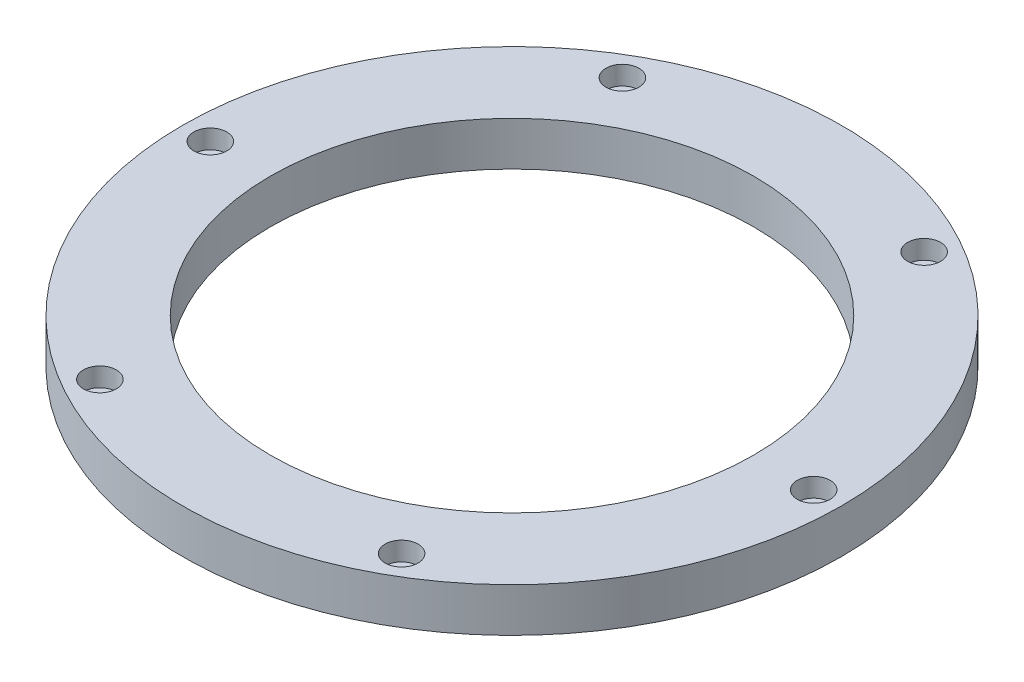
ISO-10303-21;
HEADER;
FILE_DESCRIPTION(('STEP AP214'),'2;1');
FILE_NAME('part.step','',(''),(''),'','','');
FILE_SCHEMA(('AUTOMOTIVE_DESIGN { 1 0 10303 214 1 1 1 1 }'));
ENDSEC;
DATA;
#1=APPLICATION_CONTEXT('core data for automotive mechanical design processes');
#2=APPLICATION_PROTOCOL_DEFINITION('international standard','automotive_design',2000,#1);
#3=PRODUCT_CONTEXT('',#1,'mechanical');
#4=PRODUCT('Part','Part','',(#3));
#5=PRODUCT_RELATED_PRODUCT_CATEGORY('part','',(#4));
#6=PRODUCT_DEFINITION_FORMATION('','',#4);
#7=PRODUCT_DEFINITION_CONTEXT('part definition',#1,'design');
#8=PRODUCT_DEFINITION('design','',#6,#7);
#9=PRODUCT_DEFINITION_SHAPE('','',#8);
#10=(LENGTH_UNIT() NAMED_UNIT(*) SI_UNIT(.MILLI.,.METRE.));
#11=(NAMED_UNIT(*) PLANE_ANGLE_UNIT() SI_UNIT($,.RADIAN.));
#12=(NAMED_UNIT(*) SI_UNIT($,.STERADIAN.) SOLID_ANGLE_UNIT());
#13=UNCERTAINTY_MEASURE_WITH_UNIT(LENGTH_MEASURE(1.E-05),#10,'distance_accuracy_value','');
#14=(GEOMETRIC_REPRESENTATION_CONTEXT(3) GLOBAL_UNCERTAINTY_ASSIGNED_CONTEXT((#13)) GLOBAL_UNIT_ASSIGNED_CONTEXT((#10,
#11,#12)) REPRESENTATION_CONTEXT('',''));
#15=CARTESIAN_POINT('',(0.,0.,0.));
#16=DIRECTION('',(0.,0.,1.));
#17=DIRECTION('',(1.,0.,0.));
#18=AXIS2_PLACEMENT_3D('',#15,#16,#17);
#19=CARTESIAN_POINT('',(-150.,8.53105147864184,0.));
#20=DIRECTION('',(0.,1.,0.));
#21=DIRECTION('',(-1.,0.,0.));
#22=AXIS2_PLACEMENT_3D('',#19,#20,#21);
#23=PLANE('',#22);
#24=CARTESIAN_POINT('',(-137.316515214628,8.53105147864184,9.58876100773685E-13));
#25=DIRECTION('',(0.,1.,0.));
#26=DIRECTION('',(0.,0.,1.));
#27=AXIS2_PLACEMENT_3D('',#24,#25,#26);
#28=CIRCLE('',#27,7.50000000000001);
#29=CARTESIAN_POINT('',(-137.316515214628,8.53105147864184,7.50000000000097));
#30=VERTEX_POINT('',#29);
#31=EDGE_CURVE('E120',#30,#30,#28,.T.);
#32=ORIENTED_EDGE('',*,*,#31,.F.);
#33=EDGE_LOOP('',(#32));
#34=FACE_BOUND('',#33,.T.);
#35=CARTESIAN_POINT('',(-68.6582576073145,8.53105147864184,-118.91959053502));
#36=DIRECTION('',(0.,1.,0.));
#37=DIRECTION('',(0.,0.,1.));
#38=AXIS2_PLACEMENT_3D('',#35,#36,#37);
#39=CIRCLE('',#38,7.49999999999999);
#40=CARTESIAN_POINT('',(-68.6582576073145,8.53105147864184,-111.41959053502));
#41=VERTEX_POINT('',#40);
#42=EDGE_CURVE('E108',#41,#41,#39,.T.);
#43=ORIENTED_EDGE('',*,*,#42,.F.);
#44=EDGE_LOOP('',(#43));
#45=FACE_BOUND('',#44,.T.);
#46=CARTESIAN_POINT('',(68.6582576073137,8.53105147864184,-118.91959053502));
#47=DIRECTION('',(0.,1.,0.));
#48=DIRECTION('',(0.,0.,1.));
#49=AXIS2_PLACEMENT_3D('',#46,#47,#48);
#50=CIRCLE('',#49,7.49999999999999);
#51=CARTESIAN_POINT('',(68.6582576073137,8.53105147864184,-111.41959053502));
#52=VERTEX_POINT('',#51);
#53=EDGE_CURVE('E96',#52,#52,#50,.T.);
#54=ORIENTED_EDGE('',*,*,#53,.F.);
#55=EDGE_LOOP('',(#54));
#56=FACE_BOUND('',#55,.T.);
#57=CARTESIAN_POINT('',(137.316515214628,8.53105147864184,0.));
#58=DIRECTION('',(0.,1.,0.));
#59=DIRECTION('',(0.,0.,1.));
#60=AXIS2_PLACEMENT_3D('',#57,#58,#59);
#61=CIRCLE('',#60,7.50000000000001);
#62=CARTESIAN_POINT('',(137.316515214628,8.53105147864184,7.50000000000001));
#63=VERTEX_POINT('',#62);
#64=EDGE_CURVE('E84',#63,#63,#61,.T.);
#65=ORIENTED_EDGE('',*,*,#64,.F.);
#66=EDGE_LOOP('',(#65));
#67=FACE_BOUND('',#66,.T.);
#68=CARTESIAN_POINT('',(-68.6582576073128,8.53105147864184,118.919590535021));
#69=DIRECTION('',(0.,1.,0.));
#70=DIRECTION('',(0.,0.,1.));
#71=AXIS2_PLACEMENT_3D('',#68,#69,#70);
#72=CIRCLE('',#71,7.49999999999999);
#73=CARTESIAN_POINT('',(-68.6582576073128,8.53105147864184,126.419590535021));
#74=VERTEX_POINT('',#73);
#75=EDGE_CURVE('E72',#74,#74,#72,.T.);
#76=ORIENTED_EDGE('',*,*,#75,.F.);
#77=EDGE_LOOP('',(#76));
#78=FACE_BOUND('',#77,.T.);
#79=CARTESIAN_POINT('',(68.6582576073153,8.53105147864184,118.919590535019));
#80=DIRECTION('',(0.,1.,0.));
#81=DIRECTION('',(0.,0.,1.));
#82=AXIS2_PLACEMENT_3D('',#79,#80,#81);
#83=CIRCLE('',#82,7.49999999999999);
#84=CARTESIAN_POINT('',(68.6582576073153,8.53105147864184,126.419590535019));
#85=VERTEX_POINT('',#84);
#86=EDGE_CURVE('E60',#85,#85,#83,.T.);
#87=ORIENTED_EDGE('',*,*,#86,.F.);
#88=EDGE_LOOP('',(#87));
#89=FACE_BOUND('',#88,.T.);
#90=CARTESIAN_POINT('',(0.,8.53105147864184,0.));
#91=DIRECTION('',(0.,1.,0.));
#92=DIRECTION('',(-1.,0.,0.));
#93=AXIS2_PLACEMENT_3D('',#90,#91,#92);
#94=CIRCLE('',#93,150.);
#95=CARTESIAN_POINT('',(-150.,8.53105147864184,0.));
#96=VERTEX_POINT('',#95);
#97=EDGE_CURVE('E46',#96,#96,#94,.T.);
#98=ORIENTED_EDGE('',*,*,#97,.T.);
#99=EDGE_LOOP('',(#98));
#100=FACE_BOUND('',#99,.T.);
#101=CARTESIAN_POINT('',(0.,8.53105147864184,0.));
#102=DIRECTION('',(0.,1.,0.));
#103=DIRECTION('',(-1.,0.,0.));
#104=AXIS2_PLACEMENT_3D('',#101,#102,#103);
#105=CIRCLE('',#104,110.);
#106=CARTESIAN_POINT('',(-110.,8.53105147864184,0.));
#107=VERTEX_POINT('',#106);
#108=EDGE_CURVE('E10',#107,#107,#105,.T.);
#109=ORIENTED_EDGE('',*,*,#108,.F.);
#110=EDGE_LOOP('',(#109));
#111=FACE_BOUND('',#110,.T.);
#112=ADVANCED_FACE('F32',(#34,#45,#56,#67,#78,#89,#100,#111),#23,.T.);
#113=CARTESIAN_POINT('',(0.,8.53105147864184,0.));
#114=DIRECTION('',(0.,1.,0.));
#115=DIRECTION('',(-1.,0.,0.));
#116=AXIS2_PLACEMENT_3D('',#113,#114,#115);
#117=CYLINDRICAL_SURFACE('',#116,110.);
#118=ORIENTED_EDGE('',*,*,#108,.T.);
#119=EDGE_LOOP('',(#118));
#120=FACE_BOUND('',#119,.T.);
#121=CARTESIAN_POINT('',(0.,-11.4689485213582,0.));
#122=DIRECTION('',(0.,1.,0.));
#123=DIRECTION('',(-1.,0.,0.));
#124=AXIS2_PLACEMENT_3D('',#121,#122,#123);
#125=CIRCLE('',#124,110.);
#126=CARTESIAN_POINT('',(-110.,-11.4689485213582,0.));
#127=VERTEX_POINT('',#126);
#128=EDGE_CURVE('E38',#127,#127,#125,.T.);
#129=ORIENTED_EDGE('',*,*,#128,.F.);
#130=EDGE_LOOP('',(#129));
#131=FACE_BOUND('',#130,.T.);
#132=ADVANCED_FACE('F128',(#120,#131),#117,.F.);
#133=CARTESIAN_POINT('',(-150.,-11.4689485213582,0.));
#134=DIRECTION('',(0.,-1.,0.));
#135=DIRECTION('',(1.,0.,0.));
#136=AXIS2_PLACEMENT_3D('',#133,#134,#135);
#137=PLANE('',#136);
#138=CARTESIAN_POINT('',(-137.316515214628,-11.4689485213582,9.58876100773685E-13));
#139=DIRECTION('',(0.,1.,0.));
#140=DIRECTION('',(0.,0.,1.));
#141=AXIS2_PLACEMENT_3D('',#138,#139,#140);
#142=CIRCLE('',#141,4.5);
#143=CARTESIAN_POINT('',(-137.316515214628,-11.4689485213582,4.50000000000096));
#144=VERTEX_POINT('',#143);
#145=EDGE_CURVE('E111',#144,#144,#142,.T.);
#146=ORIENTED_EDGE('',*,*,#145,.T.);
#147=EDGE_LOOP('',(#146));
#148=FACE_BOUND('',#147,.T.);
#149=CARTESIAN_POINT('',(-68.6582576073145,-11.4689485213582,-118.91959053502));
#150=DIRECTION('',(0.,1.,0.));
#151=DIRECTION('',(0.,0.,1.));
#152=AXIS2_PLACEMENT_3D('',#149,#150,#151);
#153=CIRCLE('',#152,4.5);
#154=CARTESIAN_POINT('',(-68.6582576073145,-11.4689485213582,-114.41959053502));
#155=VERTEX_POINT('',#154);
#156=EDGE_CURVE('E99',#155,#155,#153,.T.);
#157=ORIENTED_EDGE('',*,*,#156,.T.);
#158=EDGE_LOOP('',(#157));
#159=FACE_BOUND('',#158,.T.);
#160=CARTESIAN_POINT('',(68.6582576073137,-11.4689485213582,-118.91959053502));
#161=DIRECTION('',(0.,1.,0.));
#162=DIRECTION('',(0.,0.,1.));
#163=AXIS2_PLACEMENT_3D('',#160,#161,#162);
#164=CIRCLE('',#163,4.5);
#165=CARTESIAN_POINT('',(68.6582576073137,-11.4689485213582,-114.41959053502));
#166=VERTEX_POINT('',#165);
#167=EDGE_CURVE('E87',#166,#166,#164,.T.);
#168=ORIENTED_EDGE('',*,*,#167,.T.);
#169=EDGE_LOOP('',(#168));
#170=FACE_BOUND('',#169,.T.);
#171=CARTESIAN_POINT('',(137.316515214628,-11.4689485213582,0.));
#172=DIRECTION('',(0.,1.,0.));
#173=DIRECTION('',(0.,0.,1.));
#174=AXIS2_PLACEMENT_3D('',#171,#172,#173);
#175=CIRCLE('',#174,4.5);
#176=CARTESIAN_POINT('',(137.316515214628,-11.4689485213582,4.5));
#177=VERTEX_POINT('',#176);
#178=EDGE_CURVE('E75',#177,#177,#175,.T.);
#179=ORIENTED_EDGE('',*,*,#178,.T.);
#180=EDGE_LOOP('',(#179));
#181=FACE_BOUND('',#180,.T.);
#182=CARTESIAN_POINT('',(-68.6582576073128,-11.4689485213582,118.919590535021));
#183=DIRECTION('',(0.,1.,0.));
#184=DIRECTION('',(0.,0.,1.));
#185=AXIS2_PLACEMENT_3D('',#182,#183,#184);
#186=CIRCLE('',#185,4.5);
#187=CARTESIAN_POINT('',(-68.6582576073128,-11.4689485213582,123.419590535021));
#188=VERTEX_POINT('',#187);
#189=EDGE_CURVE('E63',#188,#188,#186,.T.);
#190=ORIENTED_EDGE('',*,*,#189,.T.);
#191=EDGE_LOOP('',(#190));
#192=FACE_BOUND('',#191,.T.);
#193=CARTESIAN_POINT('',(68.6582576073153,-11.4689485213582,118.919590535019));
#194=DIRECTION('',(0.,1.,0.));
#195=DIRECTION('',(0.,0.,1.));
#196=AXIS2_PLACEMENT_3D('',#193,#194,#195);
#197=CIRCLE('',#196,4.5);
#198=CARTESIAN_POINT('',(68.6582576073153,-11.4689485213582,123.419590535019));
#199=VERTEX_POINT('',#198);
#200=EDGE_CURVE('E51',#199,#199,#197,.T.);
#201=ORIENTED_EDGE('',*,*,#200,.T.);
#202=EDGE_LOOP('',(#201));
#203=FACE_BOUND('',#202,.T.);
#204=ORIENTED_EDGE('',*,*,#128,.T.);
#205=EDGE_LOOP('',(#204));
#206=FACE_BOUND('',#205,.T.);
#207=CARTESIAN_POINT('',(0.,-11.4689485213582,0.));
#208=DIRECTION('',(0.,1.,0.));
#209=DIRECTION('',(-1.,0.,0.));
#210=AXIS2_PLACEMENT_3D('',#207,#208,#209);
#211=CIRCLE('',#210,150.);
#212=CARTESIAN_POINT('',(-150.,-11.4689485213582,0.));
#213=VERTEX_POINT('',#212);
#214=EDGE_CURVE('E42',#213,#213,#211,.T.);
#215=ORIENTED_EDGE('',*,*,#214,.F.);
#216=EDGE_LOOP('',(#215));
#217=FACE_BOUND('',#216,.T.);
#218=ADVANCED_FACE('F145',(#148,#159,#170,#181,#192,#203,#206,#217),#137,.T.);
#219=CARTESIAN_POINT('',(0.,8.53105147864184,0.));
#220=DIRECTION('',(0.,1.,0.));
#221=DIRECTION('',(-1.,0.,0.));
#222=AXIS2_PLACEMENT_3D('',#219,#220,#221);
#223=CYLINDRICAL_SURFACE('',#222,150.);
#224=ORIENTED_EDGE('',*,*,#214,.T.);
#225=EDGE_LOOP('',(#224));
#226=FACE_BOUND('',#225,.T.);
#227=ORIENTED_EDGE('',*,*,#97,.F.);
#228=EDGE_LOOP('',(#227));
#229=FACE_BOUND('',#228,.T.);
#230=ADVANCED_FACE('F142',(#226,#229),#223,.T.);
#231=CARTESIAN_POINT('',(68.6582576073153,8.53105147864184,118.919590535019));
#232=DIRECTION('',(0.,1.,0.));
#233=DIRECTION('',(0.,0.,1.));
#234=AXIS2_PLACEMENT_3D('',#231,#232,#233);
#235=CYLINDRICAL_SURFACE('',#234,4.5);
#236=ORIENTED_EDGE('',*,*,#200,.F.);
#237=EDGE_LOOP('',(#236));
#238=FACE_BOUND('',#237,.T.);
#239=CARTESIAN_POINT('',(68.6582576073153,-0.0689485213581625,118.919590535019));
#240=DIRECTION('',(0.,1.,0.));
#241=DIRECTION('',(0.,0.,1.));
#242=AXIS2_PLACEMENT_3D('',#239,#240,#241);
#243=CIRCLE('',#242,4.5);
#244=CARTESIAN_POINT('',(68.6582576073153,-0.0689485213581625,123.419590535019));
#245=VERTEX_POINT('',#244);
#246=EDGE_CURVE('E54',#245,#245,#243,.T.);
#247=ORIENTED_EDGE('',*,*,#246,.T.);
#248=EDGE_LOOP('',(#247));
#249=FACE_BOUND('',#248,.T.);
#250=ADVANCED_FACE('F144',(#238,#249),#235,.F.);
#251=CARTESIAN_POINT('',(73.1582576073153,-0.0689485213581625,118.919590535019));
#252=DIRECTION('',(0.,-1.,0.));
#253=DIRECTION('',(0.,0.,-1.));
#254=AXIS2_PLACEMENT_3D('',#251,#252,#253);
#255=PLANE('',#254);
#256=ORIENTED_EDGE('',*,*,#246,.F.);
#257=EDGE_LOOP('',(#256));
#258=FACE_BOUND('',#257,.T.);
#259=CARTESIAN_POINT('',(68.6582576073153,-0.0689485213581625,118.919590535019));
#260=DIRECTION('',(0.,1.,0.));
#261=DIRECTION('',(0.,0.,1.));
#262=AXIS2_PLACEMENT_3D('',#259,#260,#261);
#263=CIRCLE('',#262,7.49999999999999);
#264=CARTESIAN_POINT('',(68.6582576073153,-0.0689485213581625,126.419590535019));
#265=VERTEX_POINT('',#264);
#266=EDGE_CURVE('E57',#265,#265,#263,.T.);
#267=ORIENTED_EDGE('',*,*,#266,.T.);
#268=EDGE_LOOP('',(#267));
#269=FACE_BOUND('',#268,.T.);
#270=ADVANCED_FACE('F152',(#258,#269),#255,.F.);
#271=CARTESIAN_POINT('',(68.6582576073153,8.53105147864184,118.919590535019));
#272=DIRECTION('',(0.,1.,0.));
#273=DIRECTION('',(0.,0.,1.));
#274=AXIS2_PLACEMENT_3D('',#271,#272,#273);
#275=CYLINDRICAL_SURFACE('',#274,7.49999999999999);
#276=ORIENTED_EDGE('',*,*,#266,.F.);
#277=EDGE_LOOP('',(#276));
#278=FACE_BOUND('',#277,.T.);
#279=ORIENTED_EDGE('',*,*,#86,.T.);
#280=EDGE_LOOP('',(#279));
#281=FACE_BOUND('',#280,.T.);
#282=ADVANCED_FACE('F186',(#278,#281),#275,.F.);
#283=CARTESIAN_POINT('',(-68.6582576073128,8.53105147864184,118.919590535021));
#284=DIRECTION('',(0.,1.,0.));
#285=DIRECTION('',(0.,0.,1.));
#286=AXIS2_PLACEMENT_3D('',#283,#284,#285);
#287=CYLINDRICAL_SURFACE('',#286,4.5);
#288=ORIENTED_EDGE('',*,*,#189,.F.);
#289=EDGE_LOOP('',(#288));
#290=FACE_BOUND('',#289,.T.);
#291=CARTESIAN_POINT('',(-68.6582576073128,-0.068948521358159,118.919590535021));
#292=DIRECTION('',(0.,1.,0.));
#293=DIRECTION('',(0.,0.,1.));
#294=AXIS2_PLACEMENT_3D('',#291,#292,#293);
#295=CIRCLE('',#294,4.5);
#296=CARTESIAN_POINT('',(-68.6582576073128,-0.068948521358159,123.419590535021));
#297=VERTEX_POINT('',#296);
#298=EDGE_CURVE('E66',#297,#297,#295,.T.);
#299=ORIENTED_EDGE('',*,*,#298,.T.);
#300=EDGE_LOOP('',(#299));
#301=FACE_BOUND('',#300,.T.);
#302=ADVANCED_FACE('F195',(#290,#301),#287,.F.);
#303=CARTESIAN_POINT('',(-64.1582576073128,-0.068948521358159,118.919590535021));
#304=DIRECTION('',(0.,-1.,0.));
#305=DIRECTION('',(0.,0.,-1.));
#306=AXIS2_PLACEMENT_3D('',#303,#304,#305);
#307=PLANE('',#306);
#308=ORIENTED_EDGE('',*,*,#298,.F.);
#309=EDGE_LOOP('',(#308));
#310=FACE_BOUND('',#309,.T.);
#311=CARTESIAN_POINT('',(-68.6582576073128,-0.068948521358159,118.919590535021));
#312=DIRECTION('',(0.,1.,0.));
#313=DIRECTION('',(0.,0.,1.));
#314=AXIS2_PLACEMENT_3D('',#311,#312,#313);
#315=CIRCLE('',#314,7.49999999999999);
#316=CARTESIAN_POINT('',(-68.6582576073128,-0.068948521358159,126.419590535021));
#317=VERTEX_POINT('',#316);
#318=EDGE_CURVE('E69',#317,#317,#315,.T.);
#319=ORIENTED_EDGE('',*,*,#318,.T.);
#320=EDGE_LOOP('',(#319));
#321=FACE_BOUND('',#320,.T.);
#322=ADVANCED_FACE('F205',(#310,#321),#307,.F.);
#323=CARTESIAN_POINT('',(-68.6582576073128,8.53105147864184,118.919590535021));
#324=DIRECTION('',(0.,1.,0.));
#325=DIRECTION('',(0.,0.,1.));
#326=AXIS2_PLACEMENT_3D('',#323,#324,#325);
#327=CYLINDRICAL_SURFACE('',#326,7.49999999999999);
#328=ORIENTED_EDGE('',*,*,#318,.F.);
#329=EDGE_LOOP('',(#328));
#330=FACE_BOUND('',#329,.T.);
#331=ORIENTED_EDGE('',*,*,#75,.T.);
#332=EDGE_LOOP('',(#331));
#333=FACE_BOUND('',#332,.T.);
#334=ADVANCED_FACE('F215',(#330,#333),#327,.F.);
#335=CARTESIAN_POINT('',(137.316515214628,8.53105147864184,0.));
#336=DIRECTION('',(0.,1.,0.));
#337=DIRECTION('',(0.,0.,1.));
#338=AXIS2_PLACEMENT_3D('',#335,#336,#337);
#339=CYLINDRICAL_SURFACE('',#338,4.5);
#340=ORIENTED_EDGE('',*,*,#178,.F.);
#341=EDGE_LOOP('',(#340));
#342=FACE_BOUND('',#341,.T.);
#343=CARTESIAN_POINT('',(137.316515214628,-0.0689485213581642,0.));
#344=DIRECTION('',(0.,1.,0.));
#345=DIRECTION('',(0.,0.,1.));
#346=AXIS2_PLACEMENT_3D('',#343,#344,#345);
#347=CIRCLE('',#346,4.5);
#348=CARTESIAN_POINT('',(137.316515214628,-0.0689485213581642,4.5));
#349=VERTEX_POINT('',#348);
#350=EDGE_CURVE('E78',#349,#349,#347,.T.);
#351=ORIENTED_EDGE('',*,*,#350,.T.);
#352=EDGE_LOOP('',(#351));
#353=FACE_BOUND('',#352,.T.);
#354=ADVANCED_FACE('F225',(#342,#353),#339,.F.);
#355=CARTESIAN_POINT('',(141.816515214628,-0.0689485213581642,0.));
#356=DIRECTION('',(0.,-1.,0.));
#357=DIRECTION('',(0.,0.,-1.));
#358=AXIS2_PLACEMENT_3D('',#355,#356,#357);
#359=PLANE('',#358);
#360=ORIENTED_EDGE('',*,*,#350,.F.);
#361=EDGE_LOOP('',(#360));
#362=FACE_BOUND('',#361,.T.);
#363=CARTESIAN_POINT('',(137.316515214628,-0.0689485213581642,0.));
#364=DIRECTION('',(0.,1.,0.));
#365=DIRECTION('',(0.,0.,1.));
#366=AXIS2_PLACEMENT_3D('',#363,#364,#365);
#367=CIRCLE('',#366,7.50000000000001);
#368=CARTESIAN_POINT('',(137.316515214628,-0.0689485213581642,7.50000000000001));
#369=VERTEX_POINT('',#368);
#370=EDGE_CURVE('E81',#369,#369,#367,.T.);
#371=ORIENTED_EDGE('',*,*,#370,.T.);
#372=EDGE_LOOP('',(#371));
#373=FACE_BOUND('',#372,.T.);
#374=ADVANCED_FACE('F235',(#362,#373),#359,.F.);
#375=CARTESIAN_POINT('',(137.316515214628,8.53105147864184,0.));
#376=DIRECTION('',(0.,1.,0.));
#377=DIRECTION('',(0.,0.,1.));
#378=AXIS2_PLACEMENT_3D('',#375,#376,#377);
#379=CYLINDRICAL_SURFACE('',#378,7.50000000000001);
#380=ORIENTED_EDGE('',*,*,#370,.F.);
#381=EDGE_LOOP('',(#380));
#382=FACE_BOUND('',#381,.T.);
#383=ORIENTED_EDGE('',*,*,#64,.T.);
#384=EDGE_LOOP('',(#383));
#385=FACE_BOUND('',#384,.T.);
#386=ADVANCED_FACE('F245',(#382,#385),#379,.F.);
#387=CARTESIAN_POINT('',(68.6582576073137,8.53105147864184,-118.91959053502));
#388=DIRECTION('',(0.,1.,0.));
#389=DIRECTION('',(0.,0.,1.));
#390=AXIS2_PLACEMENT_3D('',#387,#388,#389);
#391=CYLINDRICAL_SURFACE('',#390,4.5);
#392=ORIENTED_EDGE('',*,*,#167,.F.);
#393=EDGE_LOOP('',(#392));
#394=FACE_BOUND('',#393,.T.);
#395=CARTESIAN_POINT('',(68.6582576073137,-0.0689485213581625,-118.91959053502));
#396=DIRECTION('',(0.,1.,0.));
#397=DIRECTION('',(0.,0.,1.));
#398=AXIS2_PLACEMENT_3D('',#395,#396,#397);
#399=CIRCLE('',#398,4.5);
#400=CARTESIAN_POINT('',(68.6582576073137,-0.0689485213581625,-114.41959053502));
#401=VERTEX_POINT('',#400);
#402=EDGE_CURVE('E90',#401,#401,#399,.T.);
#403=ORIENTED_EDGE('',*,*,#402,.T.);
#404=EDGE_LOOP('',(#403));
#405=FACE_BOUND('',#404,.T.);
#406=ADVANCED_FACE('F255',(#394,#405),#391,.F.);
#407=CARTESIAN_POINT('',(73.1582576073137,-0.0689485213581625,-118.91959053502));
#408=DIRECTION('',(0.,-1.,0.));
#409=DIRECTION('',(0.,0.,-1.));
#410=AXIS2_PLACEMENT_3D('',#407,#408,#409);
#411=PLANE('',#410);
#412=ORIENTED_EDGE('',*,*,#402,.F.);
#413=EDGE_LOOP('',(#412));
#414=FACE_BOUND('',#413,.T.);
#415=CARTESIAN_POINT('',(68.6582576073137,-0.0689485213581625,-118.91959053502));
#416=DIRECTION('',(0.,1.,0.));
#417=DIRECTION('',(0.,0.,1.));
#418=AXIS2_PLACEMENT_3D('',#415,#416,#417);
#419=CIRCLE('',#418,7.49999999999999);
#420=CARTESIAN_POINT('',(68.6582576073137,-0.0689485213581625,-111.41959053502));
#421=VERTEX_POINT('',#420);
#422=EDGE_CURVE('E93',#421,#421,#419,.T.);
#423=ORIENTED_EDGE('',*,*,#422,.T.);
#424=EDGE_LOOP('',(#423));
#425=FACE_BOUND('',#424,.T.);
#426=ADVANCED_FACE('F265',(#414,#425),#411,.F.);
#427=CARTESIAN_POINT('',(68.6582576073137,8.53105147864184,-118.91959053502));
#428=DIRECTION('',(0.,1.,0.));
#429=DIRECTION('',(0.,0.,1.));
#430=AXIS2_PLACEMENT_3D('',#427,#428,#429);
#431=CYLINDRICAL_SURFACE('',#430,7.49999999999999);
#432=ORIENTED_EDGE('',*,*,#422,.F.);
#433=EDGE_LOOP('',(#432));
#434=FACE_BOUND('',#433,.T.);
#435=ORIENTED_EDGE('',*,*,#53,.T.);
#436=EDGE_LOOP('',(#435));
#437=FACE_BOUND('',#436,.T.);
#438=ADVANCED_FACE('F275',(#434,#437),#431,.F.);
#439=CARTESIAN_POINT('',(-68.6582576073145,8.53105147864184,-118.91959053502));
#440=DIRECTION('',(0.,1.,0.));
#441=DIRECTION('',(0.,0.,1.));
#442=AXIS2_PLACEMENT_3D('',#439,#440,#441);
#443=CYLINDRICAL_SURFACE('',#442,4.5);
#444=ORIENTED_EDGE('',*,*,#156,.F.);
#445=EDGE_LOOP('',(#444));
#446=FACE_BOUND('',#445,.T.);
#447=CARTESIAN_POINT('',(-68.6582576073145,-0.068948521358159,-118.91959053502));
#448=DIRECTION('',(0.,1.,0.));
#449=DIRECTION('',(0.,0.,1.));
#450=AXIS2_PLACEMENT_3D('',#447,#448,#449);
#451=CIRCLE('',#450,4.5);
#452=CARTESIAN_POINT('',(-68.6582576073145,-0.068948521358159,-114.41959053502));
#453=VERTEX_POINT('',#452);
#454=EDGE_CURVE('E102',#453,#453,#451,.T.);
#455=ORIENTED_EDGE('',*,*,#454,.T.);
#456=EDGE_LOOP('',(#455));
#457=FACE_BOUND('',#456,.T.);
#458=ADVANCED_FACE('F285',(#446,#457),#443,.F.);
#459=CARTESIAN_POINT('',(-64.1582576073145,-0.068948521358159,-118.91959053502));
#460=DIRECTION('',(0.,-1.,0.));
#461=DIRECTION('',(0.,0.,-1.));
#462=AXIS2_PLACEMENT_3D('',#459,#460,#461);
#463=PLANE('',#462);
#464=ORIENTED_EDGE('',*,*,#454,.F.);
#465=EDGE_LOOP('',(#464));
#466=FACE_BOUND('',#465,.T.);
#467=CARTESIAN_POINT('',(-68.6582576073145,-0.068948521358159,-118.91959053502));
#468=DIRECTION('',(0.,1.,0.));
#469=DIRECTION('',(0.,0.,1.));
#470=AXIS2_PLACEMENT_3D('',#467,#468,#469);
#471=CIRCLE('',#470,7.49999999999999);
#472=CARTESIAN_POINT('',(-68.6582576073145,-0.068948521358159,-111.41959053502));
#473=VERTEX_POINT('',#472);
#474=EDGE_CURVE('E105',#473,#473,#471,.T.);
#475=ORIENTED_EDGE('',*,*,#474,.T.);
#476=EDGE_LOOP('',(#475));
#477=FACE_BOUND('',#476,.T.);
#478=ADVANCED_FACE('F295',(#466,#477),#463,.F.);
#479=CARTESIAN_POINT('',(-68.6582576073145,8.53105147864184,-118.91959053502));
#480=DIRECTION('',(0.,1.,0.));
#481=DIRECTION('',(0.,0.,1.));
#482=AXIS2_PLACEMENT_3D('',#479,#480,#481);
#483=CYLINDRICAL_SURFACE('',#482,7.49999999999999);
#484=ORIENTED_EDGE('',*,*,#474,.F.);
#485=EDGE_LOOP('',(#484));
#486=FACE_BOUND('',#485,.T.);
#487=ORIENTED_EDGE('',*,*,#42,.T.);
#488=EDGE_LOOP('',(#487));
#489=FACE_BOUND('',#488,.T.);
#490=ADVANCED_FACE('F305',(#486,#489),#483,.F.);
#491=CARTESIAN_POINT('',(-137.316515214628,8.53105147864184,9.58876100773685E-13));
#492=DIRECTION('',(0.,1.,0.));
#493=DIRECTION('',(0.,0.,1.));
#494=AXIS2_PLACEMENT_3D('',#491,#492,#493);
#495=CYLINDRICAL_SURFACE('',#494,4.5);
#496=ORIENTED_EDGE('',*,*,#145,.F.);
#497=EDGE_LOOP('',(#496));
#498=FACE_BOUND('',#497,.T.);
#499=CARTESIAN_POINT('',(-137.316515214628,-0.0689485213581573,9.58876100773685E-13));
#500=DIRECTION('',(0.,1.,0.));
#501=DIRECTION('',(0.,0.,1.));
#502=AXIS2_PLACEMENT_3D('',#499,#500,#501);
#503=CIRCLE('',#502,4.5);
#504=CARTESIAN_POINT('',(-137.316515214628,-0.0689485213581573,4.50000000000096));
#505=VERTEX_POINT('',#504);
#506=EDGE_CURVE('E114',#505,#505,#503,.T.);
#507=ORIENTED_EDGE('',*,*,#506,.T.);
#508=EDGE_LOOP('',(#507));
#509=FACE_BOUND('',#508,.T.);
#510=ADVANCED_FACE('F315',(#498,#509),#495,.F.);
#511=CARTESIAN_POINT('',(-132.816515214628,-0.0689485213581573,9.58876100773685E-13));
#512=DIRECTION('',(0.,-1.,0.));
#513=DIRECTION('',(0.,0.,-1.));
#514=AXIS2_PLACEMENT_3D('',#511,#512,#513);
#515=PLANE('',#514);
#516=ORIENTED_EDGE('',*,*,#506,.F.);
#517=EDGE_LOOP('',(#516));
#518=FACE_BOUND('',#517,.T.);
#519=CARTESIAN_POINT('',(-137.316515214628,-0.0689485213581573,9.58876100773685E-13));
#520=DIRECTION('',(0.,1.,0.));
#521=DIRECTION('',(0.,0.,1.));
#522=AXIS2_PLACEMENT_3D('',#519,#520,#521);
#523=CIRCLE('',#522,7.50000000000001);
#524=CARTESIAN_POINT('',(-137.316515214628,-0.0689485213581573,7.50000000000097));
#525=VERTEX_POINT('',#524);
#526=EDGE_CURVE('E117',#525,#525,#523,.T.);
#527=ORIENTED_EDGE('',*,*,#526,.T.);
#528=EDGE_LOOP('',(#527));
#529=FACE_BOUND('',#528,.T.);
#530=ADVANCED_FACE('F325',(#518,#529),#515,.F.);
#531=CARTESIAN_POINT('',(-137.316515214628,8.53105147864184,9.58876100773685E-13));
#532=DIRECTION('',(0.,1.,0.));
#533=DIRECTION('',(0.,0.,1.));
#534=AXIS2_PLACEMENT_3D('',#531,#532,#533);
#535=CYLINDRICAL_SURFACE('',#534,7.50000000000001);
#536=ORIENTED_EDGE('',*,*,#526,.F.);
#537=EDGE_LOOP('',(#536));
#538=FACE_BOUND('',#537,.T.);
#539=ORIENTED_EDGE('',*,*,#31,.T.);
#540=EDGE_LOOP('',(#539));
#541=FACE_BOUND('',#540,.T.);
#542=ADVANCED_FACE('F124',(#538,#541),#535,.F.);
#543=CLOSED_SHELL('',(#112,#132,#218,#230,#250,#270,#282,#302,#322,#334,#354,#374,#386,#406,
#426,#438,#458,#478,#490,#510,#530,#542));
#544=MANIFOLD_SOLID_BREP('B2',#543);
#545=ADVANCED_BREP_SHAPE_REPRESENTATION('',(#18,#544),#14);
#546=SHAPE_DEFINITION_REPRESENTATION(#9,#545);
ENDSEC;
END-ISO-10303-21;
